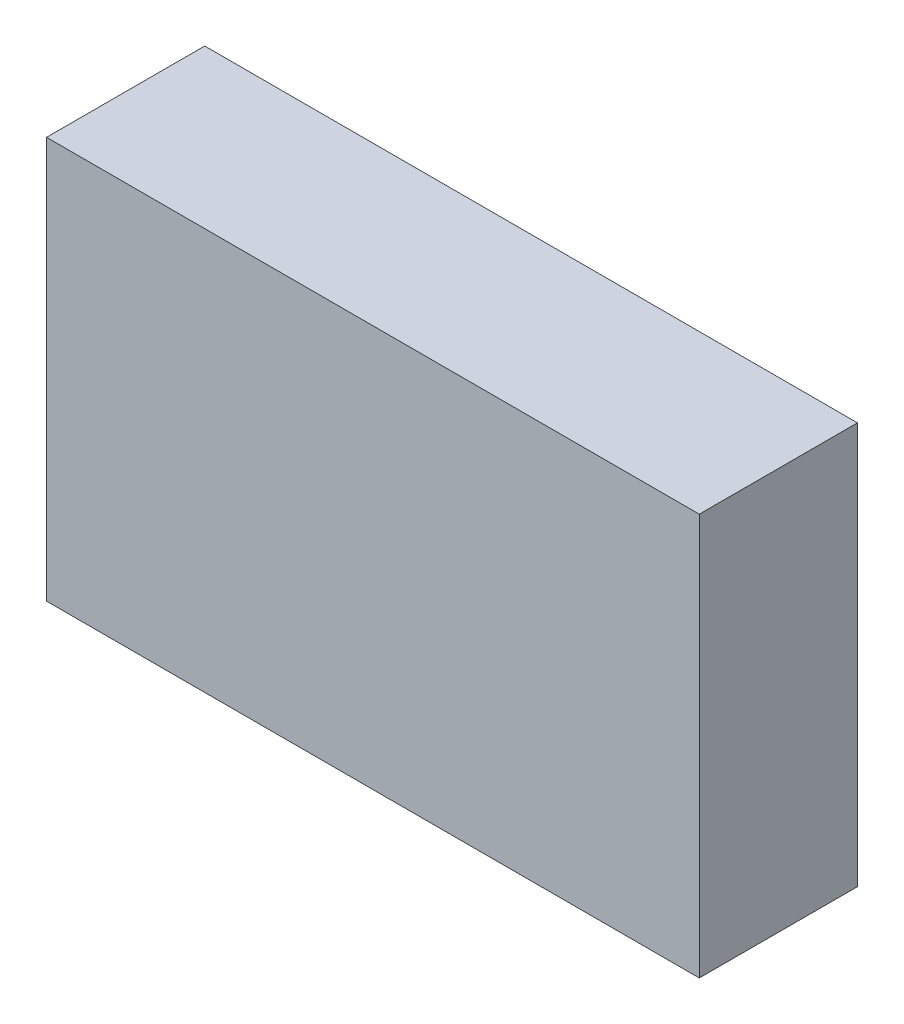
ISO-10303-21;
HEADER;
FILE_DESCRIPTION(('STEP AP214'),'2;1');
FILE_NAME('part.step','',(''),(''),'','','');
FILE_SCHEMA(('AUTOMOTIVE_DESIGN { 1 0 10303 214 1 1 1 1 }'));
ENDSEC;
DATA;
#1=APPLICATION_CONTEXT('core data for automotive mechanical design processes');
#2=APPLICATION_PROTOCOL_DEFINITION('international standard','automotive_design',2000,#1);
#3=PRODUCT_CONTEXT('',#1,'mechanical');
#4=PRODUCT('Part','Part','',(#3));
#5=PRODUCT_RELATED_PRODUCT_CATEGORY('part','',(#4));
#6=PRODUCT_DEFINITION_FORMATION('','',#4);
#7=PRODUCT_DEFINITION_CONTEXT('part definition',#1,'design');
#8=PRODUCT_DEFINITION('design','',#6,#7);
#9=PRODUCT_DEFINITION_SHAPE('','',#8);
#10=(LENGTH_UNIT() NAMED_UNIT(*) SI_UNIT(.MILLI.,.METRE.));
#11=(NAMED_UNIT(*) PLANE_ANGLE_UNIT() SI_UNIT($,.RADIAN.));
#12=(NAMED_UNIT(*) SI_UNIT($,.STERADIAN.) SOLID_ANGLE_UNIT());
#13=UNCERTAINTY_MEASURE_WITH_UNIT(LENGTH_MEASURE(1.E-05),#10,'distance_accuracy_value','');
#14=(GEOMETRIC_REPRESENTATION_CONTEXT(3) GLOBAL_UNCERTAINTY_ASSIGNED_CONTEXT((#13)) GLOBAL_UNIT_ASSIGNED_CONTEXT((#10,
#11,#12)) REPRESENTATION_CONTEXT('',''));
#15=CARTESIAN_POINT('',(0.,0.,0.));
#16=DIRECTION('',(0.,0.,1.));
#17=DIRECTION('',(1.,0.,0.));
#18=AXIS2_PLACEMENT_3D('',#15,#16,#17);
#19=CARTESIAN_POINT('',(0.,0.,0.63));
#20=DIRECTION('',(0.,0.,-1.));
#21=DIRECTION('',(0.,-1.,0.));
#22=AXIS2_PLACEMENT_3D('',#19,#20,#21);
#23=PLANE('',#22);
#24=DIRECTION('',(1.,0.,0.));
#25=VECTOR('',#24,1.);
#26=CARTESIAN_POINT('',(-1.3,0.8,0.63));
#27=LINE('',#26,#25);
#28=CARTESIAN_POINT('',(-1.3,0.8,0.63));
#29=VERTEX_POINT('',#28);
#30=CARTESIAN_POINT('',(1.3,0.8,0.63));
#31=VERTEX_POINT('',#30);
#32=EDGE_CURVE('E100',#29,#31,#27,.T.);
#33=ORIENTED_EDGE('',*,*,#32,.F.);
#34=DIRECTION('',(0.,1.,0.));
#35=VECTOR('',#34,1.);
#36=CARTESIAN_POINT('',(-1.3,-0.8,0.63));
#37=LINE('',#36,#35);
#38=CARTESIAN_POINT('',(-1.3,-0.8,0.63));
#39=VERTEX_POINT('',#38);
#40=EDGE_CURVE('E20',#39,#29,#37,.T.);
#41=ORIENTED_EDGE('',*,*,#40,.F.);
#42=DIRECTION('',(-1.,0.,0.));
#43=VECTOR('',#42,1.);
#44=CARTESIAN_POINT('',(1.3,-0.8,0.63));
#45=LINE('',#44,#43);
#46=CARTESIAN_POINT('',(1.3,-0.8,0.63));
#47=VERTEX_POINT('',#46);
#48=EDGE_CURVE('E65',#47,#39,#45,.T.);
#49=ORIENTED_EDGE('',*,*,#48,.F.);
#50=DIRECTION('',(0.,-1.,0.));
#51=VECTOR('',#50,1.);
#52=CARTESIAN_POINT('',(1.3,0.8,0.63));
#53=LINE('',#52,#51);
#54=EDGE_CURVE('E69',#31,#47,#53,.T.);
#55=ORIENTED_EDGE('',*,*,#54,.F.);
#56=EDGE_LOOP('',(#33,#41,#49,#55));
#57=FACE_BOUND('',#56,.T.);
#58=ADVANCED_FACE('F17',(#57),#23,.F.);
#59=CARTESIAN_POINT('',(0.,0.,0.));
#60=DIRECTION('',(0.,0.,-1.));
#61=DIRECTION('',(0.,-1.,0.));
#62=AXIS2_PLACEMENT_3D('',#59,#60,#61);
#63=PLANE('',#62);
#64=DIRECTION('',(1.,0.,0.));
#65=VECTOR('',#64,1.);
#66=CARTESIAN_POINT('',(-1.3,0.8,0.));
#67=LINE('',#66,#65);
#68=CARTESIAN_POINT('',(-1.3,0.8,0.));
#69=VERTEX_POINT('',#68);
#70=CARTESIAN_POINT('',(1.3,0.8,0.));
#71=VERTEX_POINT('',#70);
#72=EDGE_CURVE('E89',#69,#71,#67,.T.);
#73=ORIENTED_EDGE('',*,*,#72,.T.);
#74=DIRECTION('',(0.,-1.,0.));
#75=VECTOR('',#74,1.);
#76=CARTESIAN_POINT('',(1.3,0.8,0.));
#77=LINE('',#76,#75);
#78=CARTESIAN_POINT('',(1.3,-0.8,0.));
#79=VERTEX_POINT('',#78);
#80=EDGE_CURVE('E75',#71,#79,#77,.T.);
#81=ORIENTED_EDGE('',*,*,#80,.T.);
#82=DIRECTION('',(-1.,0.,0.));
#83=VECTOR('',#82,1.);
#84=CARTESIAN_POINT('',(1.3,-0.8,0.));
#85=LINE('',#84,#83);
#86=CARTESIAN_POINT('',(-1.3,-0.8,0.));
#87=VERTEX_POINT('',#86);
#88=EDGE_CURVE('E79',#79,#87,#85,.T.);
#89=ORIENTED_EDGE('',*,*,#88,.T.);
#90=DIRECTION('',(0.,1.,0.));
#91=VECTOR('',#90,1.);
#92=CARTESIAN_POINT('',(-1.3,-0.8,0.));
#93=LINE('',#92,#91);
#94=EDGE_CURVE('E11',#87,#69,#93,.T.);
#95=ORIENTED_EDGE('',*,*,#94,.T.);
#96=EDGE_LOOP('',(#73,#81,#89,#95));
#97=FACE_BOUND('',#96,.T.);
#98=ADVANCED_FACE('F164',(#97),#63,.T.);
#99=CARTESIAN_POINT('',(-1.3,-0.8,0.));
#100=DIRECTION('',(-1.,0.,0.));
#101=DIRECTION('',(0.,0.,1.));
#102=AXIS2_PLACEMENT_3D('',#99,#100,#101);
#103=PLANE('',#102);
#104=DIRECTION('',(0.,0.,1.));
#105=VECTOR('',#104,1.);
#106=CARTESIAN_POINT('',(-1.3,-0.8,0.));
#107=LINE('',#106,#105);
#108=EDGE_CURVE('E74',#87,#39,#107,.T.);
#109=ORIENTED_EDGE('',*,*,#108,.T.);
#110=ORIENTED_EDGE('',*,*,#40,.T.);
#111=DIRECTION('',(0.,0.,1.));
#112=VECTOR('',#111,1.);
#113=CARTESIAN_POINT('',(-1.3,0.8,0.));
#114=LINE('',#113,#112);
#115=EDGE_CURVE('E99',#69,#29,#114,.T.);
#116=ORIENTED_EDGE('',*,*,#115,.F.);
#117=ORIENTED_EDGE('',*,*,#94,.F.);
#118=EDGE_LOOP('',(#109,#110,#116,#117));
#119=FACE_BOUND('',#118,.T.);
#120=ADVANCED_FACE('F112',(#119),#103,.T.);
#121=CARTESIAN_POINT('',(1.3,-0.8,0.));
#122=DIRECTION('',(0.,-1.,0.));
#123=DIRECTION('',(0.,0.,-1.));
#124=AXIS2_PLACEMENT_3D('',#121,#122,#123);
#125=PLANE('',#124);
#126=DIRECTION('',(0.,0.,1.));
#127=VECTOR('',#126,1.);
#128=CARTESIAN_POINT('',(1.3,-0.8,0.));
#129=LINE('',#128,#127);
#130=EDGE_CURVE('E77',#79,#47,#129,.T.);
#131=ORIENTED_EDGE('',*,*,#130,.T.);
#132=ORIENTED_EDGE('',*,*,#48,.T.);
#133=ORIENTED_EDGE('',*,*,#108,.F.);
#134=ORIENTED_EDGE('',*,*,#88,.F.);
#135=EDGE_LOOP('',(#131,#132,#133,#134));
#136=FACE_BOUND('',#135,.T.);
#137=ADVANCED_FACE('F78',(#136),#125,.T.);
#138=CARTESIAN_POINT('',(1.3,0.8,0.));
#139=DIRECTION('',(1.,0.,0.));
#140=DIRECTION('',(0.,1.,0.));
#141=AXIS2_PLACEMENT_3D('',#138,#139,#140);
#142=PLANE('',#141);
#143=DIRECTION('',(0.,0.,1.));
#144=VECTOR('',#143,1.);
#145=CARTESIAN_POINT('',(1.3,0.8,0.));
#146=LINE('',#145,#144);
#147=EDGE_CURVE('E86',#71,#31,#146,.T.);
#148=ORIENTED_EDGE('',*,*,#147,.T.);
#149=ORIENTED_EDGE('',*,*,#54,.T.);
#150=ORIENTED_EDGE('',*,*,#130,.F.);
#151=ORIENTED_EDGE('',*,*,#80,.F.);
#152=EDGE_LOOP('',(#148,#149,#150,#151));
#153=FACE_BOUND('',#152,.T.);
#154=ADVANCED_FACE('F84',(#153),#142,.T.);
#155=CARTESIAN_POINT('',(-1.3,0.8,0.));
#156=DIRECTION('',(0.,1.,0.));
#157=DIRECTION('',(1.,0.,0.));
#158=AXIS2_PLACEMENT_3D('',#155,#156,#157);
#159=PLANE('',#158);
#160=ORIENTED_EDGE('',*,*,#115,.T.);
#161=ORIENTED_EDGE('',*,*,#32,.T.);
#162=ORIENTED_EDGE('',*,*,#147,.F.);
#163=ORIENTED_EDGE('',*,*,#72,.F.);
#164=EDGE_LOOP('',(#160,#161,#162,#163));
#165=FACE_BOUND('',#164,.T.);
#166=ADVANCED_FACE('F117',(#165),#159,.T.);
#167=CLOSED_SHELL('',(#58,#98,#120,#137,#154,#166));
#168=MANIFOLD_SOLID_BREP('B1',#167);
#169=ADVANCED_BREP_SHAPE_REPRESENTATION('',(#18,#168),#14);
#170=SHAPE_DEFINITION_REPRESENTATION(#9,#169);
ENDSEC;
END-ISO-10303-21;
